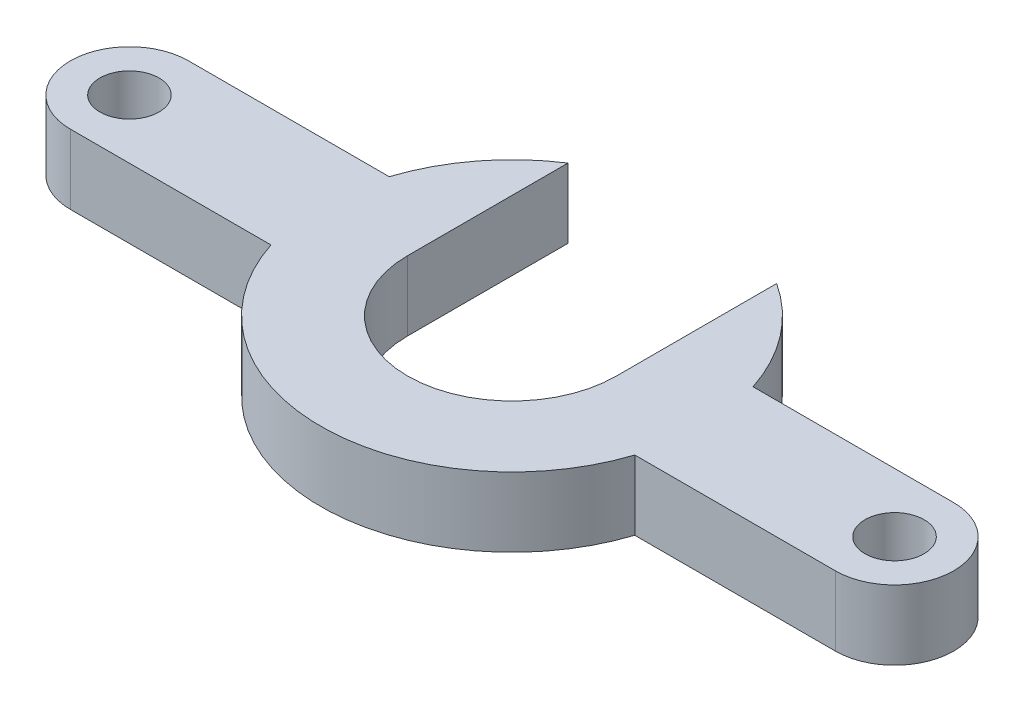
ISO-10303-21;
HEADER;
FILE_DESCRIPTION(('STEP AP214'),'2;1');
FILE_NAME('part.step','',(''),(''),'','','');
FILE_SCHEMA(('AUTOMOTIVE_DESIGN { 1 0 10303 214 1 1 1 1 }'));
ENDSEC;
DATA;
#1=APPLICATION_CONTEXT('core data for automotive mechanical design processes');
#2=APPLICATION_PROTOCOL_DEFINITION('international standard','automotive_design',2000,#1);
#3=PRODUCT_CONTEXT('',#1,'mechanical');
#4=PRODUCT('Part','Part','',(#3));
#5=PRODUCT_RELATED_PRODUCT_CATEGORY('part','',(#4));
#6=PRODUCT_DEFINITION_FORMATION('','',#4);
#7=PRODUCT_DEFINITION_CONTEXT('part definition',#1,'design');
#8=PRODUCT_DEFINITION('design','',#6,#7);
#9=PRODUCT_DEFINITION_SHAPE('','',#8);
#10=(LENGTH_UNIT() NAMED_UNIT(*) SI_UNIT(.MILLI.,.METRE.));
#11=(NAMED_UNIT(*) PLANE_ANGLE_UNIT() SI_UNIT($,.RADIAN.));
#12=(NAMED_UNIT(*) SI_UNIT($,.STERADIAN.) SOLID_ANGLE_UNIT());
#13=UNCERTAINTY_MEASURE_WITH_UNIT(LENGTH_MEASURE(1.E-05),#10,'distance_accuracy_value','');
#14=(GEOMETRIC_REPRESENTATION_CONTEXT(3) GLOBAL_UNCERTAINTY_ASSIGNED_CONTEXT((#13)) GLOBAL_UNIT_ASSIGNED_CONTEXT((#10,
#11,#12)) REPRESENTATION_CONTEXT('',''));
#15=CARTESIAN_POINT('',(0.,0.,0.));
#16=DIRECTION('',(0.,0.,1.));
#17=DIRECTION('',(1.,0.,0.));
#18=AXIS2_PLACEMENT_3D('',#15,#16,#17);
#19=CARTESIAN_POINT('',(0.,10.,0.));
#20=DIRECTION('',(0.,1.,0.));
#21=DIRECTION('',(0.,0.,1.));
#22=AXIS2_PLACEMENT_3D('',#19,#20,#21);
#23=PLANE('',#22);
#24=CARTESIAN_POINT('',(-55.,10.,0.));
#25=DIRECTION('',(0.,1.,0.));
#26=DIRECTION('',(0.,0.,1.));
#27=AXIS2_PLACEMENT_3D('',#24,#25,#26);
#28=CIRCLE('',#27,4.25);
#29=CARTESIAN_POINT('',(-55.,10.,4.25));
#30=VERTEX_POINT('',#29);
#31=EDGE_CURVE('E162',#30,#30,#28,.T.);
#32=ORIENTED_EDGE('',*,*,#31,.F.);
#33=EDGE_LOOP('',(#32));
#34=FACE_BOUND('',#33,.T.);
#35=CARTESIAN_POINT('',(0.,10.,0.));
#36=DIRECTION('',(0.,1.,0.));
#37=DIRECTION('',(0.,0.,1.));
#38=AXIS2_PLACEMENT_3D('',#35,#36,#37);
#39=CIRCLE('',#38,27.5);
#40=CARTESIAN_POINT('',(-15.,10.,-23.0488611432322));
#41=VERTEX_POINT('',#40);
#42=CARTESIAN_POINT('',(-26.153393661244,10.,-8.50000000000004));
#43=VERTEX_POINT('',#42);
#44=EDGE_CURVE('E181',#41,#43,#39,.T.);
#45=ORIENTED_EDGE('',*,*,#44,.T.);
#46=DIRECTION('',(-1.,0.,0.));
#47=VECTOR('',#46,1.);
#48=CARTESIAN_POINT('',(-26.153393661244,10.,-8.50000000000004));
#49=LINE('',#48,#47);
#50=CARTESIAN_POINT('',(-55.,10.,-8.50000000000001));
#51=VERTEX_POINT('',#50);
#52=EDGE_CURVE('E109',#43,#51,#49,.T.);
#53=ORIENTED_EDGE('',*,*,#52,.T.);
#54=CARTESIAN_POINT('',(-55.,10.,0.));
#55=DIRECTION('',(0.,1.,0.));
#56=DIRECTION('',(0.,0.,-1.));
#57=AXIS2_PLACEMENT_3D('',#54,#55,#56);
#58=CIRCLE('',#57,8.50000000000001);
#59=CARTESIAN_POINT('',(-55.,10.,8.50000000000001));
#60=VERTEX_POINT('',#59);
#61=EDGE_CURVE('E208',#51,#60,#58,.T.);
#62=ORIENTED_EDGE('',*,*,#61,.T.);
#63=DIRECTION('',(1.,0.,0.));
#64=VECTOR('',#63,1.);
#65=CARTESIAN_POINT('',(-26.153393661244,10.,8.50000000000004));
#66=LINE('',#65,#64);
#67=CARTESIAN_POINT('',(-26.153393661244,10.,8.50000000000004));
#68=VERTEX_POINT('',#67);
#69=EDGE_CURVE('E227',#60,#68,#66,.T.);
#70=ORIENTED_EDGE('',*,*,#69,.T.);
#71=CARTESIAN_POINT('',(0.,10.,0.));
#72=DIRECTION('',(0.,1.,0.));
#73=DIRECTION('',(0.,0.,1.));
#74=AXIS2_PLACEMENT_3D('',#71,#72,#73);
#75=CIRCLE('',#74,27.5);
#76=CARTESIAN_POINT('',(26.153393661244,10.,8.50000000000004));
#77=VERTEX_POINT('',#76);
#78=EDGE_CURVE('E224',#68,#77,#75,.T.);
#79=ORIENTED_EDGE('',*,*,#78,.T.);
#80=DIRECTION('',(1.,0.,0.));
#81=VECTOR('',#80,1.);
#82=CARTESIAN_POINT('',(55.,10.,8.49999999999999));
#83=LINE('',#82,#81);
#84=CARTESIAN_POINT('',(55.,10.,8.49999999999999));
#85=VERTEX_POINT('',#84);
#86=EDGE_CURVE('E226',#77,#85,#83,.T.);
#87=ORIENTED_EDGE('',*,*,#86,.T.);
#88=CARTESIAN_POINT('',(55.,10.,0.));
#89=DIRECTION('',(0.,1.,0.));
#90=DIRECTION('',(0.,0.,-1.));
#91=AXIS2_PLACEMENT_3D('',#88,#89,#90);
#92=CIRCLE('',#91,8.49999999999999);
#93=CARTESIAN_POINT('',(55.,10.,-8.50000000000002));
#94=VERTEX_POINT('',#93);
#95=EDGE_CURVE('E229',#85,#94,#92,.T.);
#96=ORIENTED_EDGE('',*,*,#95,.T.);
#97=DIRECTION('',(-1.,0.,0.));
#98=VECTOR('',#97,1.);
#99=CARTESIAN_POINT('',(55.,10.,-8.49999999999999));
#100=LINE('',#99,#98);
#101=CARTESIAN_POINT('',(26.153393661244,10.,-8.50000000000004));
#102=VERTEX_POINT('',#101);
#103=EDGE_CURVE('E235',#94,#102,#100,.T.);
#104=ORIENTED_EDGE('',*,*,#103,.T.);
#105=CARTESIAN_POINT('',(0.,10.,0.));
#106=DIRECTION('',(0.,1.,0.));
#107=DIRECTION('',(0.,0.,1.));
#108=AXIS2_PLACEMENT_3D('',#105,#106,#107);
#109=CIRCLE('',#108,27.5);
#110=CARTESIAN_POINT('',(15.,10.,-23.0488611432322));
#111=VERTEX_POINT('',#110);
#112=EDGE_CURVE('E140',#102,#111,#109,.T.);
#113=ORIENTED_EDGE('',*,*,#112,.T.);
#114=DIRECTION('',(0.,0.,1.));
#115=VECTOR('',#114,1.);
#116=CARTESIAN_POINT('',(15.,10.,0.));
#117=LINE('',#116,#115);
#118=CARTESIAN_POINT('',(15.,10.,0.));
#119=VERTEX_POINT('',#118);
#120=EDGE_CURVE('E134',#111,#119,#117,.T.);
#121=ORIENTED_EDGE('',*,*,#120,.T.);
#122=CARTESIAN_POINT('',(0.,10.,0.));
#123=DIRECTION('',(0.,-1.,0.));
#124=DIRECTION('',(0.,0.,1.));
#125=AXIS2_PLACEMENT_3D('',#122,#123,#124);
#126=CIRCLE('',#125,15.);
#127=CARTESIAN_POINT('',(-15.,10.,0.));
#128=VERTEX_POINT('',#127);
#129=EDGE_CURVE('E138',#119,#128,#126,.T.);
#130=ORIENTED_EDGE('',*,*,#129,.T.);
#131=DIRECTION('',(0.,0.,-1.));
#132=VECTOR('',#131,1.);
#133=CARTESIAN_POINT('',(-15.,10.,0.));
#134=LINE('',#133,#132);
#135=EDGE_CURVE('E54',#128,#41,#134,.T.);
#136=ORIENTED_EDGE('',*,*,#135,.T.);
#137=EDGE_LOOP('',(#45,#53,#62,#70,#79,#87,#96,#104,#113,#121,#130,#136));
#138=FACE_BOUND('',#137,.T.);
#139=CARTESIAN_POINT('',(55.,10.,0.));
#140=DIRECTION('',(0.,1.,0.));
#141=DIRECTION('',(0.,0.,1.));
#142=AXIS2_PLACEMENT_3D('',#139,#140,#141);
#143=CIRCLE('',#142,4.25);
#144=CARTESIAN_POINT('',(55.,10.,4.24999999999998));
#145=VERTEX_POINT('',#144);
#146=EDGE_CURVE('E277',#145,#145,#143,.T.);
#147=ORIENTED_EDGE('',*,*,#146,.F.);
#148=EDGE_LOOP('',(#147));
#149=FACE_BOUND('',#148,.T.);
#150=ADVANCED_FACE('F37',(#34,#138,#149),#23,.T.);
#151=CARTESIAN_POINT('',(0.,0.,0.));
#152=DIRECTION('',(0.,1.,0.));
#153=DIRECTION('',(0.,0.,1.));
#154=AXIS2_PLACEMENT_3D('',#151,#152,#153);
#155=PLANE('',#154);
#156=CARTESIAN_POINT('',(0.,0.,0.));
#157=DIRECTION('',(0.,1.,0.));
#158=DIRECTION('',(0.,0.,1.));
#159=AXIS2_PLACEMENT_3D('',#156,#157,#158);
#160=CIRCLE('',#159,27.5);
#161=CARTESIAN_POINT('',(-15.,0.,-23.0488611432322));
#162=VERTEX_POINT('',#161);
#163=CARTESIAN_POINT('',(-26.153393661244,0.,-8.50000000000004));
#164=VERTEX_POINT('',#163);
#165=EDGE_CURVE('E158',#162,#164,#160,.T.);
#166=ORIENTED_EDGE('',*,*,#165,.F.);
#167=DIRECTION('',(0.,0.,-1.));
#168=VECTOR('',#167,1.);
#169=CARTESIAN_POINT('',(-15.,0.,0.));
#170=LINE('',#169,#168);
#171=CARTESIAN_POINT('',(-15.,0.,0.));
#172=VERTEX_POINT('',#171);
#173=EDGE_CURVE('E101',#172,#162,#170,.T.);
#174=ORIENTED_EDGE('',*,*,#173,.F.);
#175=CARTESIAN_POINT('',(0.,0.,0.));
#176=DIRECTION('',(0.,-1.,0.));
#177=DIRECTION('',(0.,0.,1.));
#178=AXIS2_PLACEMENT_3D('',#175,#176,#177);
#179=CIRCLE('',#178,15.);
#180=CARTESIAN_POINT('',(15.,0.,0.));
#181=VERTEX_POINT('',#180);
#182=EDGE_CURVE('E95',#181,#172,#179,.T.);
#183=ORIENTED_EDGE('',*,*,#182,.F.);
#184=DIRECTION('',(0.,0.,1.));
#185=VECTOR('',#184,1.);
#186=CARTESIAN_POINT('',(15.,0.,0.));
#187=LINE('',#186,#185);
#188=CARTESIAN_POINT('',(15.,0.,-23.0488611432322));
#189=VERTEX_POINT('',#188);
#190=EDGE_CURVE('E148',#189,#181,#187,.T.);
#191=ORIENTED_EDGE('',*,*,#190,.F.);
#192=CARTESIAN_POINT('',(0.,0.,0.));
#193=DIRECTION('',(0.,1.,0.));
#194=DIRECTION('',(0.,0.,1.));
#195=AXIS2_PLACEMENT_3D('',#192,#193,#194);
#196=CIRCLE('',#195,27.5);
#197=CARTESIAN_POINT('',(26.153393661244,0.,-8.50000000000004));
#198=VERTEX_POINT('',#197);
#199=EDGE_CURVE('E176',#198,#189,#196,.T.);
#200=ORIENTED_EDGE('',*,*,#199,.F.);
#201=DIRECTION('',(-1.,0.,0.));
#202=VECTOR('',#201,1.);
#203=CARTESIAN_POINT('',(55.,0.,-8.49999999999999));
#204=LINE('',#203,#202);
#205=CARTESIAN_POINT('',(55.,0.,-8.50000000000002));
#206=VERTEX_POINT('',#205);
#207=EDGE_CURVE('E174',#206,#198,#204,.T.);
#208=ORIENTED_EDGE('',*,*,#207,.F.);
#209=CARTESIAN_POINT('',(55.,0.,0.));
#210=DIRECTION('',(0.,1.,0.));
#211=DIRECTION('',(0.,0.,-1.));
#212=AXIS2_PLACEMENT_3D('',#209,#210,#211);
#213=CIRCLE('',#212,8.49999999999999);
#214=CARTESIAN_POINT('',(55.,0.,8.49999999999999));
#215=VERTEX_POINT('',#214);
#216=EDGE_CURVE('E172',#215,#206,#213,.T.);
#217=ORIENTED_EDGE('',*,*,#216,.F.);
#218=DIRECTION('',(1.,0.,0.));
#219=VECTOR('',#218,1.);
#220=CARTESIAN_POINT('',(55.,0.,8.49999999999999));
#221=LINE('',#220,#219);
#222=CARTESIAN_POINT('',(26.153393661244,0.,8.50000000000004));
#223=VERTEX_POINT('',#222);
#224=EDGE_CURVE('E170',#223,#215,#221,.T.);
#225=ORIENTED_EDGE('',*,*,#224,.F.);
#226=CARTESIAN_POINT('',(0.,0.,0.));
#227=DIRECTION('',(0.,1.,0.));
#228=DIRECTION('',(0.,0.,1.));
#229=AXIS2_PLACEMENT_3D('',#226,#227,#228);
#230=CIRCLE('',#229,27.5);
#231=CARTESIAN_POINT('',(-26.153393661244,0.,8.50000000000004));
#232=VERTEX_POINT('',#231);
#233=EDGE_CURVE('E168',#232,#223,#230,.T.);
#234=ORIENTED_EDGE('',*,*,#233,.F.);
#235=DIRECTION('',(1.,0.,0.));
#236=VECTOR('',#235,1.);
#237=CARTESIAN_POINT('',(-26.153393661244,0.,8.50000000000004));
#238=LINE('',#237,#236);
#239=CARTESIAN_POINT('',(-55.,0.,8.50000000000001));
#240=VERTEX_POINT('',#239);
#241=EDGE_CURVE('E166',#240,#232,#238,.T.);
#242=ORIENTED_EDGE('',*,*,#241,.F.);
#243=CARTESIAN_POINT('',(-55.,0.,0.));
#244=DIRECTION('',(0.,1.,0.));
#245=DIRECTION('',(0.,0.,-1.));
#246=AXIS2_PLACEMENT_3D('',#243,#244,#245);
#247=CIRCLE('',#246,8.50000000000001);
#248=CARTESIAN_POINT('',(-55.,0.,-8.50000000000001));
#249=VERTEX_POINT('',#248);
#250=EDGE_CURVE('E164',#249,#240,#247,.T.);
#251=ORIENTED_EDGE('',*,*,#250,.F.);
#252=DIRECTION('',(-1.,0.,0.));
#253=VECTOR('',#252,1.);
#254=CARTESIAN_POINT('',(-26.153393661244,0.,-8.50000000000004));
#255=LINE('',#254,#253);
#256=EDGE_CURVE('E161',#164,#249,#255,.T.);
#257=ORIENTED_EDGE('',*,*,#256,.F.);
#258=EDGE_LOOP('',(#166,#174,#183,#191,#200,#208,#217,#225,#234,#242,#251,#257));
#259=FACE_BOUND('',#258,.T.);
#260=CARTESIAN_POINT('',(-55.,0.,0.));
#261=DIRECTION('',(0.,1.,0.));
#262=DIRECTION('',(0.,0.,1.));
#263=AXIS2_PLACEMENT_3D('',#260,#261,#262);
#264=CIRCLE('',#263,4.25);
#265=CARTESIAN_POINT('',(-55.,0.,4.25));
#266=VERTEX_POINT('',#265);
#267=EDGE_CURVE('E283',#266,#266,#264,.T.);
#268=ORIENTED_EDGE('',*,*,#267,.T.);
#269=EDGE_LOOP('',(#268));
#270=FACE_BOUND('',#269,.T.);
#271=CARTESIAN_POINT('',(55.,0.,0.));
#272=DIRECTION('',(0.,1.,0.));
#273=DIRECTION('',(0.,0.,1.));
#274=AXIS2_PLACEMENT_3D('',#271,#272,#273);
#275=CIRCLE('',#274,4.25);
#276=CARTESIAN_POINT('',(55.,0.,4.24999999999998));
#277=VERTEX_POINT('',#276);
#278=EDGE_CURVE('E280',#277,#277,#275,.T.);
#279=ORIENTED_EDGE('',*,*,#278,.T.);
#280=EDGE_LOOP('',(#279));
#281=FACE_BOUND('',#280,.T.);
#282=ADVANCED_FACE('F212',(#259,#270,#281),#155,.F.);
#283=CARTESIAN_POINT('',(0.,10.,0.));
#284=DIRECTION('',(0.,-1.,0.));
#285=DIRECTION('',(0.,0.,-1.));
#286=AXIS2_PLACEMENT_3D('',#283,#284,#285);
#287=CYLINDRICAL_SURFACE('',#286,27.5);
#288=ORIENTED_EDGE('',*,*,#165,.T.);
#289=DIRECTION('',(0.,-1.,0.));
#290=VECTOR('',#289,1.);
#291=CARTESIAN_POINT('',(-26.153393661244,10.,-8.50000000000004));
#292=LINE('',#291,#290);
#293=EDGE_CURVE('E11',#43,#164,#292,.T.);
#294=ORIENTED_EDGE('',*,*,#293,.F.);
#295=ORIENTED_EDGE('',*,*,#44,.F.);
#296=DIRECTION('',(0.,-1.,0.));
#297=VECTOR('',#296,1.);
#298=CARTESIAN_POINT('',(-15.,10.,-23.0488611432322));
#299=LINE('',#298,#297);
#300=EDGE_CURVE('E154',#41,#162,#299,.T.);
#301=ORIENTED_EDGE('',*,*,#300,.T.);
#302=EDGE_LOOP('',(#288,#294,#295,#301));
#303=FACE_BOUND('',#302,.T.);
#304=ADVANCED_FACE('F39',(#303),#287,.T.);
#305=CARTESIAN_POINT('',(-26.153393661244,10.,-8.50000000000004));
#306=DIRECTION('',(0.,0.,1.));
#307=DIRECTION('',(1.,0.,0.));
#308=AXIS2_PLACEMENT_3D('',#305,#306,#307);
#309=PLANE('',#308);
#310=ORIENTED_EDGE('',*,*,#256,.T.);
#311=DIRECTION('',(0.,-1.,0.));
#312=VECTOR('',#311,1.);
#313=CARTESIAN_POINT('',(-55.,10.,-8.50000000000001));
#314=LINE('',#313,#312);
#315=EDGE_CURVE('E46',#51,#249,#314,.T.);
#316=ORIENTED_EDGE('',*,*,#315,.F.);
#317=ORIENTED_EDGE('',*,*,#52,.F.);
#318=ORIENTED_EDGE('',*,*,#293,.T.);
#319=EDGE_LOOP('',(#310,#316,#317,#318));
#320=FACE_BOUND('',#319,.T.);
#321=ADVANCED_FACE('F386',(#320),#309,.F.);
#322=CARTESIAN_POINT('',(-55.,10.,0.));
#323=DIRECTION('',(0.,-1.,0.));
#324=DIRECTION('',(0.,0.,-1.));
#325=AXIS2_PLACEMENT_3D('',#322,#323,#324);
#326=CYLINDRICAL_SURFACE('',#325,8.50000000000001);
#327=ORIENTED_EDGE('',*,*,#250,.T.);
#328=DIRECTION('',(0.,-1.,0.));
#329=VECTOR('',#328,1.);
#330=CARTESIAN_POINT('',(-55.,10.,8.50000000000001));
#331=LINE('',#330,#329);
#332=EDGE_CURVE('E200',#60,#240,#331,.T.);
#333=ORIENTED_EDGE('',*,*,#332,.F.);
#334=ORIENTED_EDGE('',*,*,#61,.F.);
#335=ORIENTED_EDGE('',*,*,#315,.T.);
#336=EDGE_LOOP('',(#327,#333,#334,#335));
#337=FACE_BOUND('',#336,.T.);
#338=ADVANCED_FACE('F206',(#337),#326,.T.);
#339=CARTESIAN_POINT('',(-26.153393661244,10.,8.50000000000004));
#340=DIRECTION('',(0.,0.,-1.));
#341=DIRECTION('',(-1.,0.,0.));
#342=AXIS2_PLACEMENT_3D('',#339,#340,#341);
#343=PLANE('',#342);
#344=ORIENTED_EDGE('',*,*,#241,.T.);
#345=DIRECTION('',(0.,-1.,0.));
#346=VECTOR('',#345,1.);
#347=CARTESIAN_POINT('',(-26.153393661244,10.,8.50000000000004));
#348=LINE('',#347,#346);
#349=EDGE_CURVE('E197',#68,#232,#348,.T.);
#350=ORIENTED_EDGE('',*,*,#349,.F.);
#351=ORIENTED_EDGE('',*,*,#69,.F.);
#352=ORIENTED_EDGE('',*,*,#332,.T.);
#353=EDGE_LOOP('',(#344,#350,#351,#352));
#354=FACE_BOUND('',#353,.T.);
#355=ADVANCED_FACE('F218',(#354),#343,.F.);
#356=CARTESIAN_POINT('',(0.,10.,0.));
#357=DIRECTION('',(0.,-1.,0.));
#358=DIRECTION('',(0.,0.,-1.));
#359=AXIS2_PLACEMENT_3D('',#356,#357,#358);
#360=CYLINDRICAL_SURFACE('',#359,27.5);
#361=ORIENTED_EDGE('',*,*,#233,.T.);
#362=DIRECTION('',(0.,-1.,0.));
#363=VECTOR('',#362,1.);
#364=CARTESIAN_POINT('',(26.153393661244,10.,8.50000000000004));
#365=LINE('',#364,#363);
#366=EDGE_CURVE('E194',#77,#223,#365,.T.);
#367=ORIENTED_EDGE('',*,*,#366,.F.);
#368=ORIENTED_EDGE('',*,*,#78,.F.);
#369=ORIENTED_EDGE('',*,*,#349,.T.);
#370=EDGE_LOOP('',(#361,#367,#368,#369));
#371=FACE_BOUND('',#370,.T.);
#372=ADVANCED_FACE('F222',(#371),#360,.T.);
#373=CARTESIAN_POINT('',(55.,10.,8.49999999999999));
#374=DIRECTION('',(0.,0.,-1.));
#375=DIRECTION('',(-1.,0.,0.));
#376=AXIS2_PLACEMENT_3D('',#373,#374,#375);
#377=PLANE('',#376);
#378=ORIENTED_EDGE('',*,*,#224,.T.);
#379=DIRECTION('',(0.,-1.,0.));
#380=VECTOR('',#379,1.);
#381=CARTESIAN_POINT('',(55.,10.,8.49999999999999));
#382=LINE('',#381,#380);
#383=EDGE_CURVE('E191',#85,#215,#382,.T.);
#384=ORIENTED_EDGE('',*,*,#383,.F.);
#385=ORIENTED_EDGE('',*,*,#86,.F.);
#386=ORIENTED_EDGE('',*,*,#366,.T.);
#387=EDGE_LOOP('',(#378,#384,#385,#386));
#388=FACE_BOUND('',#387,.T.);
#389=ADVANCED_FACE('F347',(#388),#377,.F.);
#390=CARTESIAN_POINT('',(55.,10.,0.));
#391=DIRECTION('',(0.,-1.,0.));
#392=DIRECTION('',(0.,0.,-1.));
#393=AXIS2_PLACEMENT_3D('',#390,#391,#392);
#394=CYLINDRICAL_SURFACE('',#393,8.49999999999999);
#395=ORIENTED_EDGE('',*,*,#216,.T.);
#396=DIRECTION('',(0.,-1.,0.));
#397=VECTOR('',#396,1.);
#398=CARTESIAN_POINT('',(55.,10.,-8.50000000000002));
#399=LINE('',#398,#397);
#400=EDGE_CURVE('E188',#94,#206,#399,.T.);
#401=ORIENTED_EDGE('',*,*,#400,.F.);
#402=ORIENTED_EDGE('',*,*,#95,.F.);
#403=ORIENTED_EDGE('',*,*,#383,.T.);
#404=EDGE_LOOP('',(#395,#401,#402,#403));
#405=FACE_BOUND('',#404,.T.);
#406=ADVANCED_FACE('F337',(#405),#394,.T.);
#407=CARTESIAN_POINT('',(55.,10.,-8.49999999999999));
#408=DIRECTION('',(0.,0.,1.));
#409=DIRECTION('',(1.,0.,0.));
#410=AXIS2_PLACEMENT_3D('',#407,#408,#409);
#411=PLANE('',#410);
#412=ORIENTED_EDGE('',*,*,#207,.T.);
#413=DIRECTION('',(0.,-1.,0.));
#414=VECTOR('',#413,1.);
#415=CARTESIAN_POINT('',(26.153393661244,10.,-8.50000000000004));
#416=LINE('',#415,#414);
#417=EDGE_CURVE('E185',#102,#198,#416,.T.);
#418=ORIENTED_EDGE('',*,*,#417,.F.);
#419=ORIENTED_EDGE('',*,*,#103,.F.);
#420=ORIENTED_EDGE('',*,*,#400,.T.);
#421=EDGE_LOOP('',(#412,#418,#419,#420));
#422=FACE_BOUND('',#421,.T.);
#423=ADVANCED_FACE('F241',(#422),#411,.F.);
#424=CARTESIAN_POINT('',(0.,10.,0.));
#425=DIRECTION('',(0.,-1.,0.));
#426=DIRECTION('',(0.,0.,-1.));
#427=AXIS2_PLACEMENT_3D('',#424,#425,#426);
#428=CYLINDRICAL_SURFACE('',#427,27.5);
#429=ORIENTED_EDGE('',*,*,#199,.T.);
#430=DIRECTION('',(0.,-1.,0.));
#431=VECTOR('',#430,1.);
#432=CARTESIAN_POINT('',(15.,10.,-23.0488611432322));
#433=LINE('',#432,#431);
#434=EDGE_CURVE('E149',#111,#189,#433,.T.);
#435=ORIENTED_EDGE('',*,*,#434,.F.);
#436=ORIENTED_EDGE('',*,*,#112,.F.);
#437=ORIENTED_EDGE('',*,*,#417,.T.);
#438=EDGE_LOOP('',(#429,#435,#436,#437));
#439=FACE_BOUND('',#438,.T.);
#440=ADVANCED_FACE('F245',(#439),#428,.T.);
#441=CARTESIAN_POINT('',(15.,10.,0.));
#442=DIRECTION('',(1.,0.,0.));
#443=DIRECTION('',(0.,0.,-1.));
#444=AXIS2_PLACEMENT_3D('',#441,#442,#443);
#445=PLANE('',#444);
#446=ORIENTED_EDGE('',*,*,#190,.T.);
#447=DIRECTION('',(0.,-1.,0.));
#448=VECTOR('',#447,1.);
#449=CARTESIAN_POINT('',(15.,10.,0.));
#450=LINE('',#449,#448);
#451=EDGE_CURVE('E145',#119,#181,#450,.T.);
#452=ORIENTED_EDGE('',*,*,#451,.F.);
#453=ORIENTED_EDGE('',*,*,#120,.F.);
#454=ORIENTED_EDGE('',*,*,#434,.T.);
#455=EDGE_LOOP('',(#446,#452,#453,#454));
#456=FACE_BOUND('',#455,.T.);
#457=ADVANCED_FACE('F146',(#456),#445,.F.);
#458=CARTESIAN_POINT('',(0.,10.,0.));
#459=DIRECTION('',(0.,-1.,0.));
#460=DIRECTION('',(0.,0.,-1.));
#461=AXIS2_PLACEMENT_3D('',#458,#459,#460);
#462=CYLINDRICAL_SURFACE('',#461,15.);
#463=ORIENTED_EDGE('',*,*,#182,.T.);
#464=DIRECTION('',(0.,-1.,0.));
#465=VECTOR('',#464,1.);
#466=CARTESIAN_POINT('',(-15.,10.,0.));
#467=LINE('',#466,#465);
#468=EDGE_CURVE('E150',#128,#172,#467,.T.);
#469=ORIENTED_EDGE('',*,*,#468,.F.);
#470=ORIENTED_EDGE('',*,*,#129,.F.);
#471=ORIENTED_EDGE('',*,*,#451,.T.);
#472=EDGE_LOOP('',(#463,#469,#470,#471));
#473=FACE_BOUND('',#472,.T.);
#474=ADVANCED_FACE('F152',(#473),#462,.F.);
#475=CARTESIAN_POINT('',(-15.,10.,0.));
#476=DIRECTION('',(-1.,0.,0.));
#477=DIRECTION('',(0.,0.,1.));
#478=AXIS2_PLACEMENT_3D('',#475,#476,#477);
#479=PLANE('',#478);
#480=ORIENTED_EDGE('',*,*,#173,.T.);
#481=ORIENTED_EDGE('',*,*,#300,.F.);
#482=ORIENTED_EDGE('',*,*,#135,.F.);
#483=ORIENTED_EDGE('',*,*,#468,.T.);
#484=EDGE_LOOP('',(#480,#481,#482,#483));
#485=FACE_BOUND('',#484,.T.);
#486=ADVANCED_FACE('F249',(#485),#479,.F.);
#487=CARTESIAN_POINT('',(-55.,10.,0.));
#488=DIRECTION('',(0.,-1.,0.));
#489=DIRECTION('',(0.,0.,-1.));
#490=AXIS2_PLACEMENT_3D('',#487,#488,#489);
#491=CYLINDRICAL_SURFACE('',#490,4.25);
#492=ORIENTED_EDGE('',*,*,#31,.T.);
#493=EDGE_LOOP('',(#492));
#494=FACE_BOUND('',#493,.T.);
#495=ORIENTED_EDGE('',*,*,#267,.F.);
#496=EDGE_LOOP('',(#495));
#497=FACE_BOUND('',#496,.T.);
#498=ADVANCED_FACE('F251',(#494,#497),#491,.F.);
#499=CARTESIAN_POINT('',(55.,10.,0.));
#500=DIRECTION('',(0.,-1.,0.));
#501=DIRECTION('',(0.,0.,-1.));
#502=AXIS2_PLACEMENT_3D('',#499,#500,#501);
#503=CYLINDRICAL_SURFACE('',#502,4.25);
#504=ORIENTED_EDGE('',*,*,#146,.T.);
#505=EDGE_LOOP('',(#504));
#506=FACE_BOUND('',#505,.T.);
#507=ORIENTED_EDGE('',*,*,#278,.F.);
#508=EDGE_LOOP('',(#507));
#509=FACE_BOUND('',#508,.T.);
#510=ADVANCED_FACE('F257',(#506,#509),#503,.F.);
#511=CLOSED_SHELL('',(#150,#282,#304,#321,#338,#355,#372,#389,#406,#423,#440,#457,#474,#486,
#498,#510));
#512=MANIFOLD_SOLID_BREP('B2',#511);
#513=ADVANCED_BREP_SHAPE_REPRESENTATION('',(#18,#512),#14);
#514=SHAPE_DEFINITION_REPRESENTATION(#9,#513);
ENDSEC;
END-ISO-10303-21;
